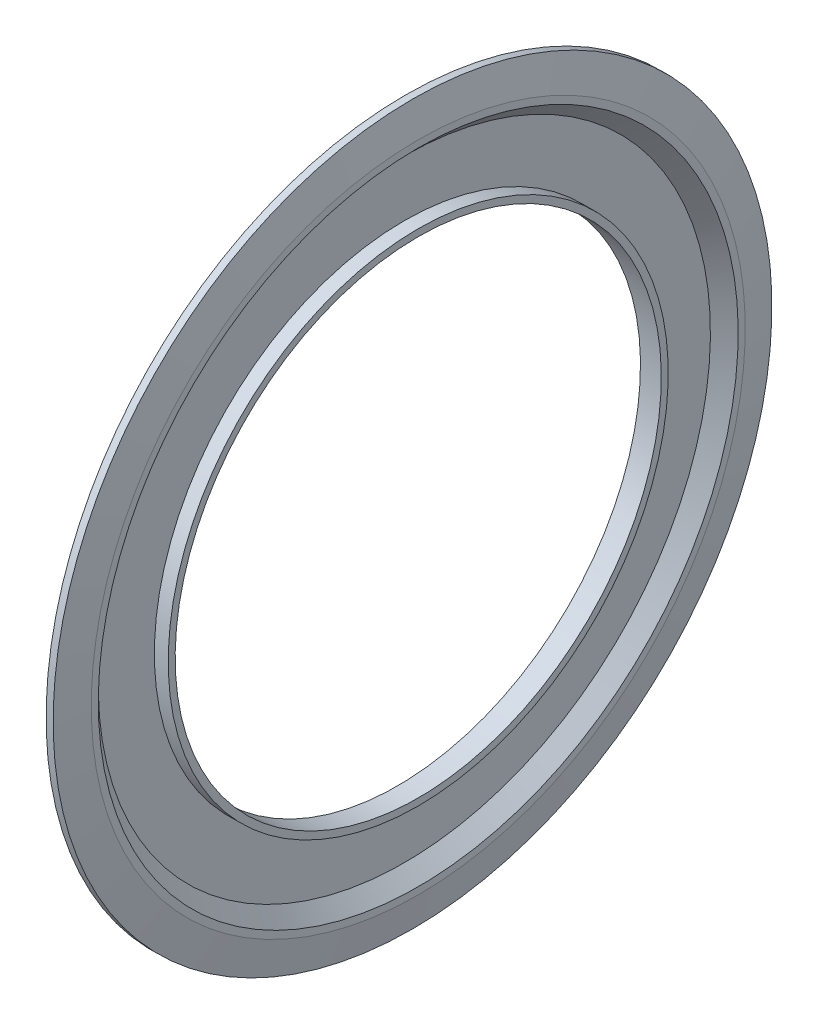
ISO-10303-21;
HEADER;
FILE_DESCRIPTION(('STEP AP214'),'2;1');
FILE_NAME('part.step','',(''),(''),'','','');
FILE_SCHEMA(('AUTOMOTIVE_DESIGN { 1 0 10303 214 1 1 1 1 }'));
ENDSEC;
DATA;
#1=APPLICATION_CONTEXT('core data for automotive mechanical design processes');
#2=APPLICATION_PROTOCOL_DEFINITION('international standard','automotive_design',2000,#1);
#3=PRODUCT_CONTEXT('',#1,'mechanical');
#4=PRODUCT('Part','Part','',(#3));
#5=PRODUCT_RELATED_PRODUCT_CATEGORY('part','',(#4));
#6=PRODUCT_DEFINITION_FORMATION('','',#4);
#7=PRODUCT_DEFINITION_CONTEXT('part definition',#1,'design');
#8=PRODUCT_DEFINITION('design','',#6,#7);
#9=PRODUCT_DEFINITION_SHAPE('','',#8);
#10=(LENGTH_UNIT() NAMED_UNIT(*) SI_UNIT(.MILLI.,.METRE.));
#11=(NAMED_UNIT(*) PLANE_ANGLE_UNIT() SI_UNIT($,.RADIAN.));
#12=(NAMED_UNIT(*) SI_UNIT($,.STERADIAN.) SOLID_ANGLE_UNIT());
#13=UNCERTAINTY_MEASURE_WITH_UNIT(LENGTH_MEASURE(1.E-05),#10,'distance_accuracy_value','');
#14=(GEOMETRIC_REPRESENTATION_CONTEXT(3) GLOBAL_UNCERTAINTY_ASSIGNED_CONTEXT((#13)) GLOBAL_UNIT_ASSIGNED_CONTEXT((#10,
#11,#12)) REPRESENTATION_CONTEXT('',''));
#15=CARTESIAN_POINT('',(0.,0.,0.));
#16=DIRECTION('',(0.,0.,1.));
#17=DIRECTION('',(1.,0.,0.));
#18=AXIS2_PLACEMENT_3D('',#15,#16,#17);
#19=CARTESIAN_POINT('',(0.821553724366851,9.793,0.));
#20=DIRECTION('',(1.,0.,0.));
#21=DIRECTION('',(0.,-1.,0.));
#22=AXIS2_PLACEMENT_3D('',#19,#20,#21);
#23=PLANE('',#22);
#24=CARTESIAN_POINT('',(0.821553724366851,0.,0.));
#25=DIRECTION('',(-1.,0.,0.));
#26=DIRECTION('',(0.,1.,0.));
#27=AXIS2_PLACEMENT_3D('',#24,#25,#26);
#28=CIRCLE('',#27,9.686);
#29=CARTESIAN_POINT('',(0.821553724366851,9.686,0.));
#30=VERTEX_POINT('',#29);
#31=EDGE_CURVE('E11',#30,#30,#28,.T.);
#32=ORIENTED_EDGE('',*,*,#31,.T.);
#33=EDGE_LOOP('',(#32));
#34=FACE_BOUND('',#33,.T.);
#35=CARTESIAN_POINT('',(0.821553724366851,0.,0.));
#36=DIRECTION('',(-1.,0.,0.));
#37=DIRECTION('',(0.,1.,0.));
#38=AXIS2_PLACEMENT_3D('',#35,#36,#37);
#39=CIRCLE('',#38,9.9);
#40=CARTESIAN_POINT('',(0.821553724366851,9.9,0.));
#41=VERTEX_POINT('',#40);
#42=EDGE_CURVE('E60',#41,#41,#39,.T.);
#43=ORIENTED_EDGE('',*,*,#42,.F.);
#44=EDGE_LOOP('',(#43));
#45=FACE_BOUND('',#44,.T.);
#46=ADVANCED_FACE('F16',(#34,#45),#23,.T.);
#47=CARTESIAN_POINT('',(0.611553724366851,0.,0.));
#48=DIRECTION('',(1.,0.,0.));
#49=DIRECTION('',(0.,1.,0.));
#50=AXIS2_PLACEMENT_3D('',#47,#48,#49);
#51=CONICAL_SURFACE('',#50,9.476,0.785398163397445);
#52=CARTESIAN_POINT('',(0.401553724366851,0.,0.));
#53=DIRECTION('',(-1.,0.,0.));
#54=DIRECTION('',(0.,1.,0.));
#55=AXIS2_PLACEMENT_3D('',#52,#53,#54);
#56=CIRCLE('',#55,9.266);
#57=CARTESIAN_POINT('',(0.401553724366851,9.266,0.));
#58=VERTEX_POINT('',#57);
#59=EDGE_CURVE('E26',#58,#58,#56,.T.);
#60=ORIENTED_EDGE('',*,*,#59,.T.);
#61=EDGE_LOOP('',(#60));
#62=FACE_BOUND('',#61,.T.);
#63=ORIENTED_EDGE('',*,*,#31,.F.);
#64=EDGE_LOOP('',(#63));
#65=FACE_BOUND('',#64,.T.);
#66=ADVANCED_FACE('F114',(#62,#65),#51,.F.);
#67=CARTESIAN_POINT('',(0.401553724366851,8.417375,0.));
#68=DIRECTION('',(1.,0.,0.));
#69=DIRECTION('',(0.,-1.,0.));
#70=AXIS2_PLACEMENT_3D('',#67,#68,#69);
#71=PLANE('',#70);
#72=CARTESIAN_POINT('',(0.401553724366851,0.,0.));
#73=DIRECTION('',(-1.,0.,0.));
#74=DIRECTION('',(0.,1.,0.));
#75=AXIS2_PLACEMENT_3D('',#72,#73,#74);
#76=CIRCLE('',#75,7.56875);
#77=CARTESIAN_POINT('',(0.401553724366851,7.56875,0.));
#78=VERTEX_POINT('',#77);
#79=EDGE_CURVE('E19',#78,#78,#76,.T.);
#80=ORIENTED_EDGE('',*,*,#79,.T.);
#81=EDGE_LOOP('',(#80));
#82=FACE_BOUND('',#81,.T.);
#83=ORIENTED_EDGE('',*,*,#59,.F.);
#84=EDGE_LOOP('',(#83));
#85=FACE_BOUND('',#84,.T.);
#86=ADVANCED_FACE('F97',(#82,#85),#71,.T.);
#87=CARTESIAN_POINT('',(0.611553724366851,0.,0.));
#88=DIRECTION('',(1.,0.,0.));
#89=DIRECTION('',(0.,1.,0.));
#90=AXIS2_PLACEMENT_3D('',#87,#88,#89);
#91=CYLINDRICAL_SURFACE('',#90,7.56875);
#92=CARTESIAN_POINT('',(0.821553724366851,0.,0.));
#93=DIRECTION('',(-1.,0.,0.));
#94=DIRECTION('',(0.,1.,0.));
#95=AXIS2_PLACEMENT_3D('',#92,#93,#94);
#96=CIRCLE('',#95,7.56875);
#97=CARTESIAN_POINT('',(0.821553724366851,7.56875,0.));
#98=VERTEX_POINT('',#97);
#99=EDGE_CURVE('E71',#98,#98,#96,.T.);
#100=ORIENTED_EDGE('',*,*,#99,.T.);
#101=EDGE_LOOP('',(#100));
#102=FACE_BOUND('',#101,.T.);
#103=ORIENTED_EDGE('',*,*,#79,.F.);
#104=EDGE_LOOP('',(#103));
#105=FACE_BOUND('',#104,.T.);
#106=ADVANCED_FACE('F101',(#102,#105),#91,.T.);
#107=CARTESIAN_POINT('',(0.821553724366851,7.46375,0.));
#108=DIRECTION('',(1.,0.,0.));
#109=DIRECTION('',(0.,-1.,0.));
#110=AXIS2_PLACEMENT_3D('',#107,#108,#109);
#111=PLANE('',#110);
#112=CARTESIAN_POINT('',(0.821553724366851,0.,0.));
#113=DIRECTION('',(-1.,0.,0.));
#114=DIRECTION('',(0.,1.,0.));
#115=AXIS2_PLACEMENT_3D('',#112,#113,#114);
#116=CIRCLE('',#115,7.35875);
#117=CARTESIAN_POINT('',(0.821553724366851,7.35875,0.));
#118=VERTEX_POINT('',#117);
#119=EDGE_CURVE('E68',#118,#118,#116,.T.);
#120=ORIENTED_EDGE('',*,*,#119,.T.);
#121=EDGE_LOOP('',(#120));
#122=FACE_BOUND('',#121,.T.);
#123=ORIENTED_EDGE('',*,*,#99,.F.);
#124=EDGE_LOOP('',(#123));
#125=FACE_BOUND('',#124,.T.);
#126=ADVANCED_FACE('F103',(#122,#125),#111,.T.);
#127=CARTESIAN_POINT('',(0.506553724366851,0.,0.));
#128=DIRECTION('',(1.,0.,0.));
#129=DIRECTION('',(0.,1.,0.));
#130=AXIS2_PLACEMENT_3D('',#127,#128,#129);
#131=CYLINDRICAL_SURFACE('',#130,7.35875);
#132=CARTESIAN_POINT('',(0.191553724366852,0.,0.));
#133=DIRECTION('',(-1.,0.,0.));
#134=DIRECTION('',(0.,1.,0.));
#135=AXIS2_PLACEMENT_3D('',#132,#133,#134);
#136=CIRCLE('',#135,7.35875);
#137=CARTESIAN_POINT('',(0.191553724366852,7.35875,0.));
#138=VERTEX_POINT('',#137);
#139=EDGE_CURVE('E72',#138,#138,#136,.T.);
#140=ORIENTED_EDGE('',*,*,#139,.T.);
#141=EDGE_LOOP('',(#140));
#142=FACE_BOUND('',#141,.T.);
#143=ORIENTED_EDGE('',*,*,#119,.F.);
#144=EDGE_LOOP('',(#143));
#145=FACE_BOUND('',#144,.T.);
#146=ADVANCED_FACE('F111',(#142,#145),#131,.F.);
#147=CARTESIAN_POINT('',(0.191553724366852,8.35586742404918,0.));
#148=DIRECTION('',(-1.,0.,0.));
#149=DIRECTION('',(0.,1.,0.));
#150=AXIS2_PLACEMENT_3D('',#147,#148,#149);
#151=PLANE('',#150);
#152=CARTESIAN_POINT('',(0.191553724366852,0.,0.));
#153=DIRECTION('',(-1.,0.,0.));
#154=DIRECTION('',(0.,1.,0.));
#155=AXIS2_PLACEMENT_3D('',#152,#153,#154);
#156=CIRCLE('',#155,9.35298484809836);
#157=CARTESIAN_POINT('',(0.191553724366852,9.35298484809836,0.));
#158=VERTEX_POINT('',#157);
#159=EDGE_CURVE('E78',#158,#158,#156,.T.);
#160=ORIENTED_EDGE('',*,*,#159,.T.);
#161=EDGE_LOOP('',(#160));
#162=FACE_BOUND('',#161,.T.);
#163=ORIENTED_EDGE('',*,*,#139,.F.);
#164=EDGE_LOOP('',(#163));
#165=FACE_BOUND('',#164,.T.);
#166=ADVANCED_FACE('F150',(#162,#165),#151,.T.);
#167=CARTESIAN_POINT('',(0.401553724366851,0.,0.));
#168=DIRECTION('',(1.,0.,0.));
#169=DIRECTION('',(0.,1.,0.));
#170=AXIS2_PLACEMENT_3D('',#167,#168,#169);
#171=CONICAL_SURFACE('',#170,9.56298484809835,0.785398163397447);
#172=CARTESIAN_POINT('',(0.611553724366851,0.,0.));
#173=DIRECTION('',(-1.,0.,0.));
#174=DIRECTION('',(0.,1.,0.));
#175=AXIS2_PLACEMENT_3D('',#172,#173,#174);
#176=CIRCLE('',#175,9.77298484809835);
#177=CARTESIAN_POINT('',(0.611553724366851,9.77298484809835,0.));
#178=VERTEX_POINT('',#177);
#179=EDGE_CURVE('E74',#178,#178,#176,.T.);
#180=ORIENTED_EDGE('',*,*,#179,.T.);
#181=EDGE_LOOP('',(#180));
#182=FACE_BOUND('',#181,.T.);
#183=ORIENTED_EDGE('',*,*,#159,.F.);
#184=EDGE_LOOP('',(#183));
#185=FACE_BOUND('',#184,.T.);
#186=ADVANCED_FACE('F139',(#182,#185),#171,.T.);
#187=CARTESIAN_POINT('',(0.611553724366851,9.82730611437896,0.));
#188=DIRECTION('',(-1.,0.,0.));
#189=DIRECTION('',(0.,1.,0.));
#190=AXIS2_PLACEMENT_3D('',#187,#188,#189);
#191=PLANE('',#190);
#192=CARTESIAN_POINT('',(0.611553724366851,0.,0.));
#193=DIRECTION('',(-1.,0.,0.));
#194=DIRECTION('',(0.,1.,0.));
#195=AXIS2_PLACEMENT_3D('',#192,#193,#194);
#196=CIRCLE('',#195,9.88162738065956);
#197=CARTESIAN_POINT('',(0.611553724366851,9.88162738065956,0.));
#198=VERTEX_POINT('',#197);
#199=EDGE_CURVE('E79',#198,#198,#196,.T.);
#200=ORIENTED_EDGE('',*,*,#199,.T.);
#201=EDGE_LOOP('',(#200));
#202=FACE_BOUND('',#201,.T.);
#203=ORIENTED_EDGE('',*,*,#179,.F.);
#204=EDGE_LOOP('',(#203));
#205=FACE_BOUND('',#204,.T.);
#206=ADVANCED_FACE('F134',(#202,#205),#191,.T.);
#207=CARTESIAN_POINT('',(0.5235337095717,0.,0.));
#208=DIRECTION('',(-1.,0.,0.));
#209=DIRECTION('',(0.,1.,0.));
#210=AXIS2_PLACEMENT_3D('',#207,#208,#209);
#211=CONICAL_SURFACE('',#210,10.3808136903298,1.39626340159546);
#212=CARTESIAN_POINT('',(0.435513694776548,0.,0.));
#213=DIRECTION('',(-1.,0.,0.));
#214=DIRECTION('',(0.,1.,0.));
#215=AXIS2_PLACEMENT_3D('',#212,#213,#214);
#216=CIRCLE('',#215,10.88);
#217=CARTESIAN_POINT('',(0.435513694776548,10.88,0.));
#218=VERTEX_POINT('',#217);
#219=EDGE_CURVE('E65',#218,#218,#216,.T.);
#220=ORIENTED_EDGE('',*,*,#219,.T.);
#221=EDGE_LOOP('',(#220));
#222=FACE_BOUND('',#221,.T.);
#223=ORIENTED_EDGE('',*,*,#199,.F.);
#224=EDGE_LOOP('',(#223));
#225=FACE_BOUND('',#224,.T.);
#226=ADVANCED_FACE('F131',(#222,#225),#211,.F.);
#227=CARTESIAN_POINT('',(0.542133489024552,0.,0.));
#228=DIRECTION('',(1.,0.,0.));
#229=DIRECTION('',(0.,1.,0.));
#230=AXIS2_PLACEMENT_3D('',#227,#228,#229);
#231=CYLINDRICAL_SURFACE('',#230,10.88);
#232=CARTESIAN_POINT('',(0.648753283272555,0.,0.));
#233=DIRECTION('',(-1.,0.,0.));
#234=DIRECTION('',(0.,1.,0.));
#235=AXIS2_PLACEMENT_3D('',#232,#233,#234);
#236=CIRCLE('',#235,10.88);
#237=CARTESIAN_POINT('',(0.648753283272555,10.88,0.));
#238=VERTEX_POINT('',#237);
#239=EDGE_CURVE('E55',#238,#238,#236,.T.);
#240=ORIENTED_EDGE('',*,*,#239,.T.);
#241=EDGE_LOOP('',(#240));
#242=FACE_BOUND('',#241,.T.);
#243=ORIENTED_EDGE('',*,*,#219,.F.);
#244=EDGE_LOOP('',(#243));
#245=FACE_BOUND('',#244,.T.);
#246=ADVANCED_FACE('F56',(#242,#245),#231,.T.);
#247=CARTESIAN_POINT('',(0.735153503819703,0.,0.));
#248=DIRECTION('',(-1.,0.,0.));
#249=DIRECTION('',(0.,1.,0.));
#250=AXIS2_PLACEMENT_3D('',#247,#248,#249);
#251=CONICAL_SURFACE('',#250,10.39,1.39626340159546);
#252=ORIENTED_EDGE('',*,*,#42,.T.);
#253=EDGE_LOOP('',(#252));
#254=FACE_BOUND('',#253,.T.);
#255=ORIENTED_EDGE('',*,*,#239,.F.);
#256=EDGE_LOOP('',(#255));
#257=FACE_BOUND('',#256,.T.);
#258=ADVANCED_FACE('F125',(#254,#257),#251,.T.);
#259=CLOSED_SHELL('',(#46,#66,#86,#106,#126,#146,#166,#186,#206,#226,#246,#258));
#260=MANIFOLD_SOLID_BREP('B1',#259);
#261=ADVANCED_BREP_SHAPE_REPRESENTATION('',(#18,#260),#14);
#262=SHAPE_DEFINITION_REPRESENTATION(#9,#261);
ENDSEC;
END-ISO-10303-21;
